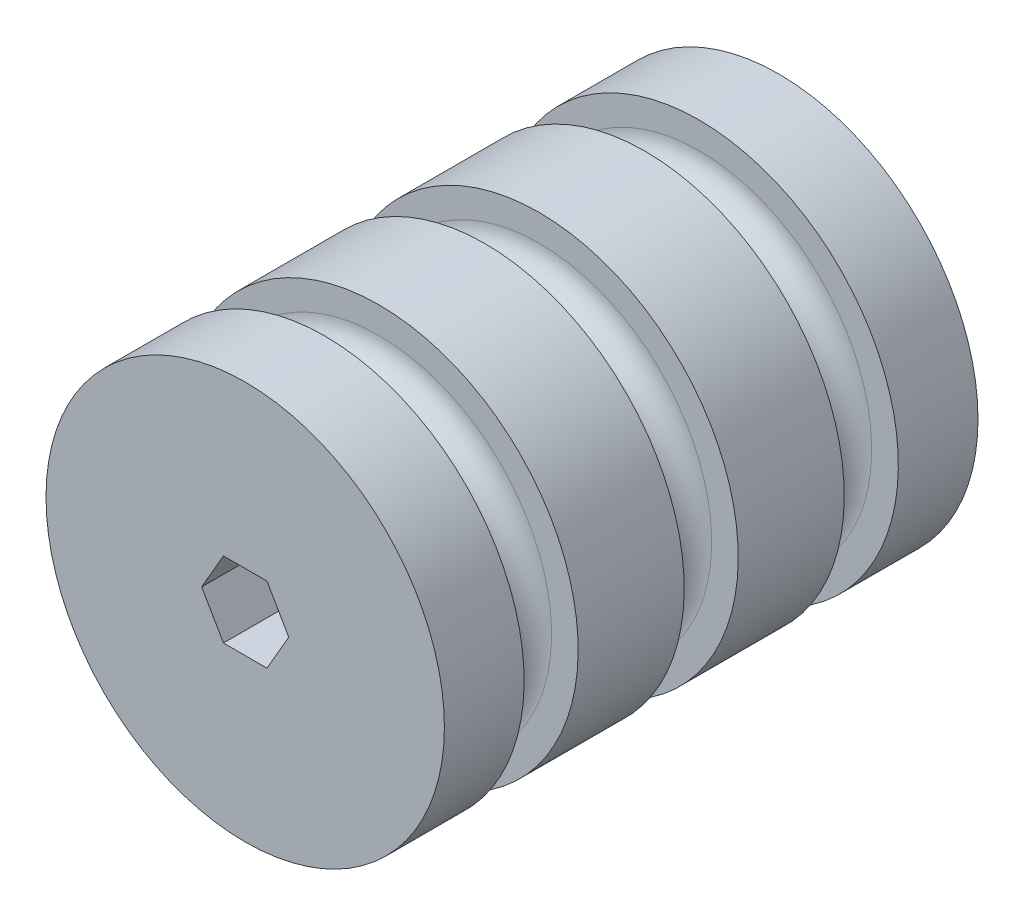
ISO-10303-21;
HEADER;
FILE_DESCRIPTION(('STEP AP214'),'2;1');
FILE_NAME('part.step','',(''),(''),'','','');
FILE_SCHEMA(('AUTOMOTIVE_DESIGN { 1 0 10303 214 1 1 1 1 }'));
ENDSEC;
DATA;
#1=APPLICATION_CONTEXT('core data for automotive mechanical design processes');
#2=APPLICATION_PROTOCOL_DEFINITION('international standard','automotive_design',2000,#1);
#3=PRODUCT_CONTEXT('',#1,'mechanical');
#4=PRODUCT('Part','Part','',(#3));
#5=PRODUCT_RELATED_PRODUCT_CATEGORY('part','',(#4));
#6=PRODUCT_DEFINITION_FORMATION('','',#4);
#7=PRODUCT_DEFINITION_CONTEXT('part definition',#1,'design');
#8=PRODUCT_DEFINITION('design','',#6,#7);
#9=PRODUCT_DEFINITION_SHAPE('','',#8);
#10=(LENGTH_UNIT() NAMED_UNIT(*) SI_UNIT(.MILLI.,.METRE.));
#11=(NAMED_UNIT(*) PLANE_ANGLE_UNIT() SI_UNIT($,.RADIAN.));
#12=(NAMED_UNIT(*) SI_UNIT($,.STERADIAN.) SOLID_ANGLE_UNIT());
#13=UNCERTAINTY_MEASURE_WITH_UNIT(LENGTH_MEASURE(1.E-05),#10,'distance_accuracy_value','');
#14=(GEOMETRIC_REPRESENTATION_CONTEXT(3) GLOBAL_UNCERTAINTY_ASSIGNED_CONTEXT((#13)) GLOBAL_UNIT_ASSIGNED_CONTEXT((#10,
#11,#12)) REPRESENTATION_CONTEXT('',''));
#15=CARTESIAN_POINT('',(0.,0.,0.));
#16=DIRECTION('',(0.,0.,1.));
#17=DIRECTION('',(1.,0.,0.));
#18=AXIS2_PLACEMENT_3D('',#15,#16,#17);
#19=CARTESIAN_POINT('',(0.,0.,95.25));
#20=DIRECTION('',(0.,0.,-1.));
#21=DIRECTION('',(-1.,0.,0.));
#22=AXIS2_PLACEMENT_3D('',#19,#20,#21);
#23=CYLINDRICAL_SURFACE('',#22,35.56);
#24=CARTESIAN_POINT('',(0.,0.,14.224));
#25=DIRECTION('',(0.,0.,-1.));
#26=DIRECTION('',(0.,1.,0.));
#27=AXIS2_PLACEMENT_3D('',#24,#25,#26);
#28=CIRCLE('',#27,35.56);
#29=CARTESIAN_POINT('',(0.,35.56,14.224));
#30=VERTEX_POINT('',#29);
#31=EDGE_CURVE('E198',#30,#30,#28,.T.);
#32=ORIENTED_EDGE('',*,*,#31,.T.);
#33=EDGE_LOOP('',(#32));
#34=FACE_BOUND('',#33,.T.);
#35=CARTESIAN_POINT('',(0.,0.,0.));
#36=DIRECTION('',(0.,0.,1.));
#37=DIRECTION('',(1.,0.,0.));
#38=AXIS2_PLACEMENT_3D('',#35,#36,#37);
#39=CIRCLE('',#38,35.56);
#40=CARTESIAN_POINT('',(35.56,0.,0.));
#41=VERTEX_POINT('',#40);
#42=EDGE_CURVE('E41',#41,#41,#39,.T.);
#43=ORIENTED_EDGE('',*,*,#42,.T.);
#44=EDGE_LOOP('',(#43));
#45=FACE_BOUND('',#44,.T.);
#46=ADVANCED_FACE('F37',(#34,#45),#23,.T.);
#47=CARTESIAN_POINT('',(0.,0.,95.25));
#48=DIRECTION('',(0.,0.,1.));
#49=DIRECTION('',(1.,0.,0.));
#50=AXIS2_PLACEMENT_3D('',#47,#48,#49);
#51=PLANE('',#50);
#52=CARTESIAN_POINT('',(0.,0.,95.25));
#53=DIRECTION('',(0.,0.,1.));
#54=DIRECTION('',(1.,0.,0.));
#55=AXIS2_PLACEMENT_3D('',#52,#53,#54);
#56=CIRCLE('',#55,35.56);
#57=CARTESIAN_POINT('',(35.56,0.,95.25));
#58=VERTEX_POINT('',#57);
#59=EDGE_CURVE('E11',#58,#58,#56,.T.);
#60=ORIENTED_EDGE('',*,*,#59,.T.);
#61=EDGE_LOOP('',(#60));
#62=FACE_BOUND('',#61,.T.);
#63=DIRECTION('',(0.5,-0.866025403784439,0.));
#64=VECTOR('',#63,1.);
#65=CARTESIAN_POINT('',(-3.88614466191538,-6.73100000000001,95.25));
#66=LINE('',#65,#64);
#67=CARTESIAN_POINT('',(-7.77228932383075,0.,95.25));
#68=VERTEX_POINT('',#67);
#69=CARTESIAN_POINT('',(-3.88614466191538,-6.73100000000001,95.25));
#70=VERTEX_POINT('',#69);
#71=EDGE_CURVE('E98',#68,#70,#66,.T.);
#72=ORIENTED_EDGE('',*,*,#71,.F.);
#73=DIRECTION('',(-0.500000000000001,-0.866025403784438,0.));
#74=VECTOR('',#73,1.);
#75=CARTESIAN_POINT('',(-7.77228932383075,0.,95.25));
#76=LINE('',#75,#74);
#77=CARTESIAN_POINT('',(-3.88614466191537,6.73100000000001,95.25));
#78=VERTEX_POINT('',#77);
#79=EDGE_CURVE('E90',#78,#68,#76,.T.);
#80=ORIENTED_EDGE('',*,*,#79,.F.);
#81=DIRECTION('',(-1.,0.,0.));
#82=VECTOR('',#81,1.);
#83=CARTESIAN_POINT('',(-3.88614466191537,6.73100000000001,95.25));
#84=LINE('',#83,#82);
#85=CARTESIAN_POINT('',(3.88614466191538,6.73100000000001,95.25));
#86=VERTEX_POINT('',#85);
#87=EDGE_CURVE('E120',#86,#78,#84,.T.);
#88=ORIENTED_EDGE('',*,*,#87,.F.);
#89=DIRECTION('',(-0.5,0.866025403784439,0.));
#90=VECTOR('',#89,1.);
#91=CARTESIAN_POINT('',(3.88614466191538,6.73100000000001,95.25));
#92=LINE('',#91,#90);
#93=CARTESIAN_POINT('',(7.77228932383075,0.,95.25));
#94=VERTEX_POINT('',#93);
#95=EDGE_CURVE('E118',#94,#86,#92,.T.);
#96=ORIENTED_EDGE('',*,*,#95,.F.);
#97=DIRECTION('',(0.5,0.866025403784438,0.));
#98=VECTOR('',#97,1.);
#99=CARTESIAN_POINT('',(7.77228932383075,0.,95.25));
#100=LINE('',#99,#98);
#101=CARTESIAN_POINT('',(3.88614466191537,-6.73100000000001,95.25));
#102=VERTEX_POINT('',#101);
#103=EDGE_CURVE('E113',#102,#94,#100,.T.);
#104=ORIENTED_EDGE('',*,*,#103,.F.);
#105=DIRECTION('',(1.,0.,0.));
#106=VECTOR('',#105,1.);
#107=CARTESIAN_POINT('',(3.88614466191537,-6.73100000000001,95.25));
#108=LINE('',#107,#106);
#109=EDGE_CURVE('E111',#70,#102,#108,.T.);
#110=ORIENTED_EDGE('',*,*,#109,.F.);
#111=EDGE_LOOP('',(#72,#80,#88,#96,#104,#110));
#112=FACE_BOUND('',#111,.T.);
#113=ADVANCED_FACE('F109',(#62,#112),#51,.T.);
#114=CARTESIAN_POINT('',(0.,0.,0.));
#115=DIRECTION('',(0.,0.,1.));
#116=DIRECTION('',(1.,0.,0.));
#117=AXIS2_PLACEMENT_3D('',#114,#115,#116);
#118=PLANE('',#117);
#119=ORIENTED_EDGE('',*,*,#42,.F.);
#120=EDGE_LOOP('',(#119));
#121=FACE_BOUND('',#120,.T.);
#122=DIRECTION('',(-0.500000000000001,-0.866025403784438,0.));
#123=VECTOR('',#122,1.);
#124=CARTESIAN_POINT('',(-7.77228932383075,0.,0.));
#125=LINE('',#124,#123);
#126=CARTESIAN_POINT('',(-3.88614466191537,6.73100000000001,0.));
#127=VERTEX_POINT('',#126);
#128=CARTESIAN_POINT('',(-7.77228932383075,0.,0.));
#129=VERTEX_POINT('',#128);
#130=EDGE_CURVE('E60',#127,#129,#125,.T.);
#131=ORIENTED_EDGE('',*,*,#130,.T.);
#132=DIRECTION('',(0.5,-0.866025403784439,0.));
#133=VECTOR('',#132,1.);
#134=CARTESIAN_POINT('',(-3.88614466191538,-6.73100000000001,0.));
#135=LINE('',#134,#133);
#136=CARTESIAN_POINT('',(-3.88614466191538,-6.73100000000001,0.));
#137=VERTEX_POINT('',#136);
#138=EDGE_CURVE('E105',#129,#137,#135,.T.);
#139=ORIENTED_EDGE('',*,*,#138,.T.);
#140=DIRECTION('',(1.,0.,0.));
#141=VECTOR('',#140,1.);
#142=CARTESIAN_POINT('',(3.88614466191537,-6.73100000000001,0.));
#143=LINE('',#142,#141);
#144=CARTESIAN_POINT('',(3.88614466191537,-6.73100000000001,0.));
#145=VERTEX_POINT('',#144);
#146=EDGE_CURVE('E125',#137,#145,#143,.T.);
#147=ORIENTED_EDGE('',*,*,#146,.T.);
#148=DIRECTION('',(0.5,0.866025403784438,0.));
#149=VECTOR('',#148,1.);
#150=CARTESIAN_POINT('',(7.77228932383075,0.,0.));
#151=LINE('',#150,#149);
#152=CARTESIAN_POINT('',(7.77228932383075,0.,0.));
#153=VERTEX_POINT('',#152);
#154=EDGE_CURVE('E128',#145,#153,#151,.T.);
#155=ORIENTED_EDGE('',*,*,#154,.T.);
#156=DIRECTION('',(-0.5,0.866025403784439,0.));
#157=VECTOR('',#156,1.);
#158=CARTESIAN_POINT('',(3.88614466191538,6.73100000000001,0.));
#159=LINE('',#158,#157);
#160=CARTESIAN_POINT('',(3.88614466191538,6.73100000000001,0.));
#161=VERTEX_POINT('',#160);
#162=EDGE_CURVE('E131',#153,#161,#159,.T.);
#163=ORIENTED_EDGE('',*,*,#162,.T.);
#164=DIRECTION('',(-1.,0.,0.));
#165=VECTOR('',#164,1.);
#166=CARTESIAN_POINT('',(-3.88614466191537,6.73100000000001,0.));
#167=LINE('',#166,#165);
#168=EDGE_CURVE('E99',#161,#127,#167,.T.);
#169=ORIENTED_EDGE('',*,*,#168,.T.);
#170=EDGE_LOOP('',(#131,#139,#147,#155,#163,#169));
#171=FACE_BOUND('',#170,.T.);
#172=ADVANCED_FACE('F148',(#121,#171),#118,.F.);
#173=CARTESIAN_POINT('',(0.,0.,81.026));
#174=DIRECTION('',(0.,0.,-1.));
#175=DIRECTION('',(0.,1.,0.));
#176=AXIS2_PLACEMENT_3D('',#173,#174,#175);
#177=CIRCLE('',#176,35.56);
#178=CARTESIAN_POINT('',(0.,35.56,81.026));
#179=VERTEX_POINT('',#178);
#180=EDGE_CURVE('E226',#179,#179,#177,.T.);
#181=ORIENTED_EDGE('',*,*,#180,.F.);
#182=EDGE_LOOP('',(#181));
#183=FACE_BOUND('',#182,.T.);
#184=ORIENTED_EDGE('',*,*,#59,.F.);
#185=EDGE_LOOP('',(#184));
#186=FACE_BOUND('',#185,.T.);
#187=ADVANCED_FACE('F39',(#183,#186),#23,.T.);
#188=CARTESIAN_POINT('',(-7.77228932383075,0.,95.25));
#189=DIRECTION('',(0.866025403784438,-0.500000000000001,0.));
#190=DIRECTION('',(0.500000000000001,0.866025403784438,0.));
#191=AXIS2_PLACEMENT_3D('',#188,#189,#190);
#192=PLANE('',#191);
#193=ORIENTED_EDGE('',*,*,#130,.F.);
#194=DIRECTION('',(0.,0.,-1.));
#195=VECTOR('',#194,1.);
#196=CARTESIAN_POINT('',(-3.88614466191537,6.73100000000001,95.25));
#197=LINE('',#196,#195);
#198=EDGE_CURVE('E94',#78,#127,#197,.T.);
#199=ORIENTED_EDGE('',*,*,#198,.F.);
#200=ORIENTED_EDGE('',*,*,#79,.T.);
#201=DIRECTION('',(0.,0.,-1.));
#202=VECTOR('',#201,1.);
#203=CARTESIAN_POINT('',(-7.77228932383075,0.,95.25));
#204=LINE('',#203,#202);
#205=EDGE_CURVE('E93',#68,#129,#204,.T.);
#206=ORIENTED_EDGE('',*,*,#205,.T.);
#207=EDGE_LOOP('',(#193,#199,#200,#206));
#208=FACE_BOUND('',#207,.T.);
#209=ADVANCED_FACE('F92',(#208),#192,.T.);
#210=CARTESIAN_POINT('',(-3.88614466191538,-6.73100000000001,95.25));
#211=DIRECTION('',(0.866025403784439,0.5,0.));
#212=DIRECTION('',(-0.5,0.866025403784439,0.));
#213=AXIS2_PLACEMENT_3D('',#210,#211,#212);
#214=PLANE('',#213);
#215=ORIENTED_EDGE('',*,*,#138,.F.);
#216=ORIENTED_EDGE('',*,*,#205,.F.);
#217=ORIENTED_EDGE('',*,*,#71,.T.);
#218=DIRECTION('',(0.,0.,-1.));
#219=VECTOR('',#218,1.);
#220=CARTESIAN_POINT('',(-3.88614466191538,-6.73100000000001,95.25));
#221=LINE('',#220,#219);
#222=EDGE_CURVE('E106',#70,#137,#221,.T.);
#223=ORIENTED_EDGE('',*,*,#222,.T.);
#224=EDGE_LOOP('',(#215,#216,#217,#223));
#225=FACE_BOUND('',#224,.T.);
#226=ADVANCED_FACE('F102',(#225),#214,.T.);
#227=CARTESIAN_POINT('',(3.88614466191537,-6.73100000000001,95.25));
#228=DIRECTION('',(0.,1.,0.));
#229=DIRECTION('',(0.,0.,1.));
#230=AXIS2_PLACEMENT_3D('',#227,#228,#229);
#231=PLANE('',#230);
#232=ORIENTED_EDGE('',*,*,#146,.F.);
#233=ORIENTED_EDGE('',*,*,#222,.F.);
#234=ORIENTED_EDGE('',*,*,#109,.T.);
#235=DIRECTION('',(0.,0.,-1.));
#236=VECTOR('',#235,1.);
#237=CARTESIAN_POINT('',(3.88614466191537,-6.73100000000001,95.25));
#238=LINE('',#237,#236);
#239=EDGE_CURVE('E140',#102,#145,#238,.T.);
#240=ORIENTED_EDGE('',*,*,#239,.T.);
#241=EDGE_LOOP('',(#232,#233,#234,#240));
#242=FACE_BOUND('',#241,.T.);
#243=ADVANCED_FACE('F144',(#242),#231,.T.);
#244=CARTESIAN_POINT('',(7.77228932383075,0.,95.25));
#245=DIRECTION('',(-0.866025403784438,0.5,0.));
#246=DIRECTION('',(-0.5,-0.866025403784438,0.));
#247=AXIS2_PLACEMENT_3D('',#244,#245,#246);
#248=PLANE('',#247);
#249=ORIENTED_EDGE('',*,*,#154,.F.);
#250=ORIENTED_EDGE('',*,*,#239,.F.);
#251=ORIENTED_EDGE('',*,*,#103,.T.);
#252=DIRECTION('',(0.,0.,-1.));
#253=VECTOR('',#252,1.);
#254=CARTESIAN_POINT('',(7.77228932383075,0.,95.25));
#255=LINE('',#254,#253);
#256=EDGE_CURVE('E138',#94,#153,#255,.T.);
#257=ORIENTED_EDGE('',*,*,#256,.T.);
#258=EDGE_LOOP('',(#249,#250,#251,#257));
#259=FACE_BOUND('',#258,.T.);
#260=ADVANCED_FACE('F156',(#259),#248,.T.);
#261=CARTESIAN_POINT('',(3.88614466191538,6.73100000000001,95.25));
#262=DIRECTION('',(-0.866025403784439,-0.5,0.));
#263=DIRECTION('',(0.5,-0.866025403784439,0.));
#264=AXIS2_PLACEMENT_3D('',#261,#262,#263);
#265=PLANE('',#264);
#266=ORIENTED_EDGE('',*,*,#162,.F.);
#267=ORIENTED_EDGE('',*,*,#256,.F.);
#268=ORIENTED_EDGE('',*,*,#95,.T.);
#269=DIRECTION('',(0.,0.,-1.));
#270=VECTOR('',#269,1.);
#271=CARTESIAN_POINT('',(3.88614466191538,6.73100000000001,95.25));
#272=LINE('',#271,#270);
#273=EDGE_CURVE('E52',#86,#161,#272,.T.);
#274=ORIENTED_EDGE('',*,*,#273,.T.);
#275=EDGE_LOOP('',(#266,#267,#268,#274));
#276=FACE_BOUND('',#275,.T.);
#277=ADVANCED_FACE('F154',(#276),#265,.T.);
#278=CARTESIAN_POINT('',(-3.88614466191537,6.73100000000001,95.25));
#279=DIRECTION('',(0.,-1.,0.));
#280=DIRECTION('',(0.,0.,-1.));
#281=AXIS2_PLACEMENT_3D('',#278,#279,#280);
#282=PLANE('',#281);
#283=ORIENTED_EDGE('',*,*,#168,.F.);
#284=ORIENTED_EDGE('',*,*,#273,.F.);
#285=ORIENTED_EDGE('',*,*,#87,.T.);
#286=ORIENTED_EDGE('',*,*,#198,.T.);
#287=EDGE_LOOP('',(#283,#284,#285,#286));
#288=FACE_BOUND('',#287,.T.);
#289=ADVANCED_FACE('F150',(#288),#282,.T.);
#290=CARTESIAN_POINT('',(0.,0.,19.05));
#291=DIRECTION('',(0.,0.,-1.));
#292=DIRECTION('',(0.,1.,0.));
#293=AXIS2_PLACEMENT_3D('',#290,#291,#292);
#294=TOROIDAL_SURFACE('',#293,30.8102,4.826);
#295=CARTESIAN_POINT('',(0.,0.,14.224));
#296=DIRECTION('',(0.,0.,-1.));
#297=DIRECTION('',(0.,1.,0.));
#298=AXIS2_PLACEMENT_3D('',#295,#296,#297);
#299=CIRCLE('',#298,30.8102);
#300=CARTESIAN_POINT('',(0.,30.8102,14.224));
#301=VERTEX_POINT('',#300);
#302=EDGE_CURVE('E201',#301,#301,#299,.T.);
#303=ORIENTED_EDGE('',*,*,#302,.F.);
#304=EDGE_LOOP('',(#303));
#305=FACE_BOUND('',#304,.T.);
#306=CARTESIAN_POINT('',(0.,0.,23.876));
#307=DIRECTION('',(0.,0.,-1.));
#308=DIRECTION('',(0.,1.,0.));
#309=AXIS2_PLACEMENT_3D('',#306,#307,#308);
#310=CIRCLE('',#309,30.8102);
#311=CARTESIAN_POINT('',(0.,30.8102,23.876));
#312=VERTEX_POINT('',#311);
#313=EDGE_CURVE('E199',#312,#312,#310,.T.);
#314=ORIENTED_EDGE('',*,*,#313,.T.);
#315=EDGE_LOOP('',(#314));
#316=FACE_BOUND('',#315,.T.);
#317=ADVANCED_FACE('F266',(#305,#316),#294,.F.);
#318=CARTESIAN_POINT('',(0.,30.8102,14.224));
#319=DIRECTION('',(0.,0.,-1.));
#320=DIRECTION('',(0.,1.,0.));
#321=AXIS2_PLACEMENT_3D('',#318,#319,#320);
#322=PLANE('',#321);
#323=ORIENTED_EDGE('',*,*,#31,.F.);
#324=EDGE_LOOP('',(#323));
#325=FACE_BOUND('',#324,.T.);
#326=ORIENTED_EDGE('',*,*,#302,.T.);
#327=EDGE_LOOP('',(#326));
#328=FACE_BOUND('',#327,.T.);
#329=ADVANCED_FACE('F249',(#325,#328),#322,.F.);
#330=CARTESIAN_POINT('',(0.,30.8102,23.876));
#331=DIRECTION('',(0.,0.,1.));
#332=DIRECTION('',(0.,-1.,0.));
#333=AXIS2_PLACEMENT_3D('',#330,#331,#332);
#334=PLANE('',#333);
#335=ORIENTED_EDGE('',*,*,#313,.F.);
#336=EDGE_LOOP('',(#335));
#337=FACE_BOUND('',#336,.T.);
#338=CARTESIAN_POINT('',(0.,0.,23.876));
#339=DIRECTION('',(0.,0.,-1.));
#340=DIRECTION('',(0.,1.,0.));
#341=AXIS2_PLACEMENT_3D('',#338,#339,#340);
#342=CIRCLE('',#341,35.56);
#343=CARTESIAN_POINT('',(0.,35.56,23.876));
#344=VERTEX_POINT('',#343);
#345=EDGE_CURVE('E196',#344,#344,#342,.T.);
#346=ORIENTED_EDGE('',*,*,#345,.T.);
#347=EDGE_LOOP('',(#346));
#348=FACE_BOUND('',#347,.T.);
#349=ADVANCED_FACE('F241',(#337,#348),#334,.F.);
#350=CARTESIAN_POINT('',(0.,0.,76.2));
#351=DIRECTION('',(0.,0.,-1.));
#352=DIRECTION('',(0.,1.,0.));
#353=AXIS2_PLACEMENT_3D('',#350,#351,#352);
#354=TOROIDAL_SURFACE('',#353,30.8102,4.826);
#355=CARTESIAN_POINT('',(0.,0.,71.374));
#356=DIRECTION('',(0.,0.,-1.));
#357=DIRECTION('',(0.,1.,0.));
#358=AXIS2_PLACEMENT_3D('',#355,#356,#357);
#359=CIRCLE('',#358,30.8102);
#360=CARTESIAN_POINT('',(0.,30.8102,71.374));
#361=VERTEX_POINT('',#360);
#362=EDGE_CURVE('E123',#361,#361,#359,.T.);
#363=ORIENTED_EDGE('',*,*,#362,.F.);
#364=EDGE_LOOP('',(#363));
#365=FACE_BOUND('',#364,.T.);
#366=CARTESIAN_POINT('',(0.,0.,81.026));
#367=DIRECTION('',(0.,0.,-1.));
#368=DIRECTION('',(0.,1.,0.));
#369=AXIS2_PLACEMENT_3D('',#366,#367,#368);
#370=CIRCLE('',#369,30.8102);
#371=CARTESIAN_POINT('',(0.,30.8102,81.026));
#372=VERTEX_POINT('',#371);
#373=EDGE_CURVE('E222',#372,#372,#370,.T.);
#374=ORIENTED_EDGE('',*,*,#373,.T.);
#375=EDGE_LOOP('',(#374));
#376=FACE_BOUND('',#375,.T.);
#377=ADVANCED_FACE('F239',(#365,#376),#354,.F.);
#378=CARTESIAN_POINT('',(0.,30.8102,71.374));
#379=DIRECTION('',(0.,0.,-1.));
#380=DIRECTION('',(0.,1.,0.));
#381=AXIS2_PLACEMENT_3D('',#378,#379,#380);
#382=PLANE('',#381);
#383=CARTESIAN_POINT('',(0.,0.,71.374));
#384=DIRECTION('',(0.,0.,-1.));
#385=DIRECTION('',(0.,1.,0.));
#386=AXIS2_PLACEMENT_3D('',#383,#384,#385);
#387=CIRCLE('',#386,35.56);
#388=CARTESIAN_POINT('',(0.,35.56,71.374));
#389=VERTEX_POINT('',#388);
#390=EDGE_CURVE('E231',#389,#389,#387,.T.);
#391=ORIENTED_EDGE('',*,*,#390,.F.);
#392=EDGE_LOOP('',(#391));
#393=FACE_BOUND('',#392,.T.);
#394=ORIENTED_EDGE('',*,*,#362,.T.);
#395=EDGE_LOOP('',(#394));
#396=FACE_BOUND('',#395,.T.);
#397=ADVANCED_FACE('F187',(#393,#396),#382,.F.);
#398=CARTESIAN_POINT('',(0.,30.8102,81.026));
#399=DIRECTION('',(0.,0.,1.));
#400=DIRECTION('',(0.,-1.,0.));
#401=AXIS2_PLACEMENT_3D('',#398,#399,#400);
#402=PLANE('',#401);
#403=ORIENTED_EDGE('',*,*,#373,.F.);
#404=EDGE_LOOP('',(#403));
#405=FACE_BOUND('',#404,.T.);
#406=ORIENTED_EDGE('',*,*,#180,.T.);
#407=EDGE_LOOP('',(#406));
#408=FACE_BOUND('',#407,.T.);
#409=ADVANCED_FACE('F179',(#405,#408),#402,.F.);
#410=CARTESIAN_POINT('',(0.,0.,42.799));
#411=DIRECTION('',(0.,0.,-1.));
#412=DIRECTION('',(0.,1.,0.));
#413=AXIS2_PLACEMENT_3D('',#410,#411,#412);
#414=CIRCLE('',#413,35.56);
#415=CARTESIAN_POINT('',(0.,35.56,42.799));
#416=VERTEX_POINT('',#415);
#417=EDGE_CURVE('E193',#416,#416,#414,.T.);
#418=ORIENTED_EDGE('',*,*,#417,.T.);
#419=EDGE_LOOP('',(#418));
#420=FACE_BOUND('',#419,.T.);
#421=ORIENTED_EDGE('',*,*,#345,.F.);
#422=EDGE_LOOP('',(#421));
#423=FACE_BOUND('',#422,.T.);
#424=ADVANCED_FACE('F167',(#420,#423),#23,.T.);
#425=ORIENTED_EDGE('',*,*,#390,.T.);
#426=EDGE_LOOP('',(#425));
#427=FACE_BOUND('',#426,.T.);
#428=CARTESIAN_POINT('',(0.,0.,52.451));
#429=DIRECTION('',(0.,0.,-1.));
#430=DIRECTION('',(0.,1.,0.));
#431=AXIS2_PLACEMENT_3D('',#428,#429,#430);
#432=CIRCLE('',#431,35.56);
#433=CARTESIAN_POINT('',(0.,35.56,52.451));
#434=VERTEX_POINT('',#433);
#435=EDGE_CURVE('E211',#434,#434,#432,.T.);
#436=ORIENTED_EDGE('',*,*,#435,.F.);
#437=EDGE_LOOP('',(#436));
#438=FACE_BOUND('',#437,.T.);
#439=ADVANCED_FACE('F177',(#427,#438),#23,.T.);
#440=CARTESIAN_POINT('',(0.,0.,47.625));
#441=DIRECTION('',(0.,0.,-1.));
#442=DIRECTION('',(0.,1.,0.));
#443=AXIS2_PLACEMENT_3D('',#440,#441,#442);
#444=TOROIDAL_SURFACE('',#443,30.8102,4.826);
#445=CARTESIAN_POINT('',(0.,0.,42.799));
#446=DIRECTION('',(0.,0.,-1.));
#447=DIRECTION('',(0.,1.,0.));
#448=AXIS2_PLACEMENT_3D('',#445,#446,#447);
#449=CIRCLE('',#448,30.8102);
#450=CARTESIAN_POINT('',(0.,30.8102,42.799));
#451=VERTEX_POINT('',#450);
#452=EDGE_CURVE('E220',#451,#451,#449,.T.);
#453=ORIENTED_EDGE('',*,*,#452,.F.);
#454=EDGE_LOOP('',(#453));
#455=FACE_BOUND('',#454,.T.);
#456=CARTESIAN_POINT('',(0.,0.,52.451));
#457=DIRECTION('',(0.,0.,-1.));
#458=DIRECTION('',(0.,1.,0.));
#459=AXIS2_PLACEMENT_3D('',#456,#457,#458);
#460=CIRCLE('',#459,30.8102);
#461=CARTESIAN_POINT('',(0.,30.8102,52.451));
#462=VERTEX_POINT('',#461);
#463=EDGE_CURVE('E207',#462,#462,#460,.T.);
#464=ORIENTED_EDGE('',*,*,#463,.T.);
#465=EDGE_LOOP('',(#464));
#466=FACE_BOUND('',#465,.T.);
#467=ADVANCED_FACE('F185',(#455,#466),#444,.F.);
#468=CARTESIAN_POINT('',(0.,30.8102,42.799));
#469=DIRECTION('',(0.,0.,-1.));
#470=DIRECTION('',(0.,1.,0.));
#471=AXIS2_PLACEMENT_3D('',#468,#469,#470);
#472=PLANE('',#471);
#473=ORIENTED_EDGE('',*,*,#417,.F.);
#474=EDGE_LOOP('',(#473));
#475=FACE_BOUND('',#474,.T.);
#476=ORIENTED_EDGE('',*,*,#452,.T.);
#477=EDGE_LOOP('',(#476));
#478=FACE_BOUND('',#477,.T.);
#479=ADVANCED_FACE('F256',(#475,#478),#472,.F.);
#480=CARTESIAN_POINT('',(0.,30.8102,52.451));
#481=DIRECTION('',(0.,0.,1.));
#482=DIRECTION('',(0.,-1.,0.));
#483=AXIS2_PLACEMENT_3D('',#480,#481,#482);
#484=PLANE('',#483);
#485=ORIENTED_EDGE('',*,*,#463,.F.);
#486=EDGE_LOOP('',(#485));
#487=FACE_BOUND('',#486,.T.);
#488=ORIENTED_EDGE('',*,*,#435,.T.);
#489=EDGE_LOOP('',(#488));
#490=FACE_BOUND('',#489,.T.);
#491=ADVANCED_FACE('F253',(#487,#490),#484,.F.);
#492=CLOSED_SHELL('',(#46,#113,#172,#187,#209,#226,#243,#260,#277,#289,#317,#329,#349,#377,#397,
#409,#424,#439,#467,#479,#491));
#493=MANIFOLD_SOLID_BREP('B2',#492);
#494=ADVANCED_BREP_SHAPE_REPRESENTATION('',(#18,#493),#14);
#495=SHAPE_DEFINITION_REPRESENTATION(#9,#494);
ENDSEC;
END-ISO-10303-21;
